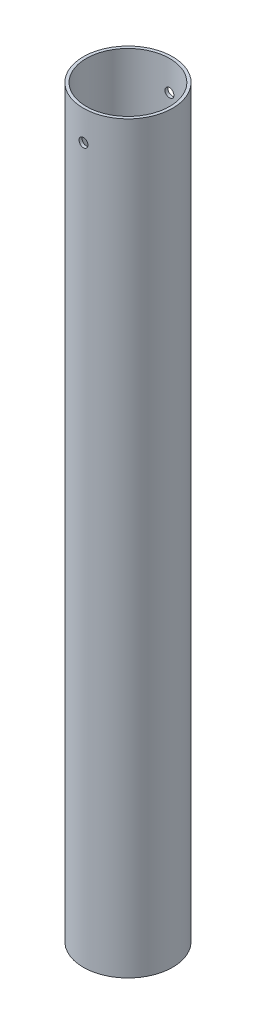
ISO-10303-21;
HEADER;
FILE_DESCRIPTION(('STEP AP214'),'2;1');
FILE_NAME('part.step','',(''),(''),'','','');
FILE_SCHEMA(('AUTOMOTIVE_DESIGN { 1 0 10303 214 1 1 1 1 }'));
ENDSEC;
DATA;
#1=APPLICATION_CONTEXT('core data for automotive mechanical design processes');
#2=APPLICATION_PROTOCOL_DEFINITION('international standard','automotive_design',2000,#1);
#3=PRODUCT_CONTEXT('',#1,'mechanical');
#4=PRODUCT('Part','Part','',(#3));
#5=PRODUCT_RELATED_PRODUCT_CATEGORY('part','',(#4));
#6=PRODUCT_DEFINITION_FORMATION('','',#4);
#7=PRODUCT_DEFINITION_CONTEXT('part definition',#1,'design');
#8=PRODUCT_DEFINITION('design','',#6,#7);
#9=PRODUCT_DEFINITION_SHAPE('','',#8);
#10=(LENGTH_UNIT() NAMED_UNIT(*) SI_UNIT(.MILLI.,.METRE.));
#11=(NAMED_UNIT(*) PLANE_ANGLE_UNIT() SI_UNIT($,.RADIAN.));
#12=(NAMED_UNIT(*) SI_UNIT($,.STERADIAN.) SOLID_ANGLE_UNIT());
#13=UNCERTAINTY_MEASURE_WITH_UNIT(LENGTH_MEASURE(1.E-05),#10,'distance_accuracy_value','');
#14=(GEOMETRIC_REPRESENTATION_CONTEXT(3) GLOBAL_UNCERTAINTY_ASSIGNED_CONTEXT((#13)) GLOBAL_UNIT_ASSIGNED_CONTEXT((#10,
#11,#12)) REPRESENTATION_CONTEXT('',''));
#15=CARTESIAN_POINT('',(0.,0.,0.));
#16=DIRECTION('',(0.,0.,1.));
#17=DIRECTION('',(1.,0.,0.));
#18=AXIS2_PLACEMENT_3D('',#15,#16,#17);
#19=CARTESIAN_POINT('',(0.,250.,0.));
#20=DIRECTION('',(0.,1.,0.));
#21=DIRECTION('',(0.,0.,1.));
#22=AXIS2_PLACEMENT_3D('',#19,#20,#21);
#23=PLANE('',#22);
#24=CARTESIAN_POINT('',(0.,250.,0.));
#25=DIRECTION('',(0.,1.,0.));
#26=DIRECTION('',(0.,0.,1.));
#27=AXIS2_PLACEMENT_3D('',#24,#25,#26);
#28=CIRCLE('',#27,15.);
#29=CARTESIAN_POINT('',(0.,250.,15.));
#30=VERTEX_POINT('',#29);
#31=EDGE_CURVE('E10',#30,#30,#28,.T.);
#32=ORIENTED_EDGE('',*,*,#31,.T.);
#33=EDGE_LOOP('',(#32));
#34=FACE_BOUND('',#33,.T.);
#35=CARTESIAN_POINT('',(0.,250.,0.));
#36=DIRECTION('',(0.,1.,0.));
#37=DIRECTION('',(0.,0.,1.));
#38=AXIS2_PLACEMENT_3D('',#35,#36,#37);
#39=CIRCLE('',#38,14.);
#40=CARTESIAN_POINT('',(0.,250.,14.));
#41=VERTEX_POINT('',#40);
#42=EDGE_CURVE('E63',#41,#41,#39,.T.);
#43=ORIENTED_EDGE('',*,*,#42,.F.);
#44=EDGE_LOOP('',(#43));
#45=FACE_BOUND('',#44,.T.);
#46=ADVANCED_FACE('F42',(#34,#45),#23,.T.);
#47=CARTESIAN_POINT('',(0.,0.,0.));
#48=DIRECTION('',(0.,1.,0.));
#49=DIRECTION('',(0.,0.,1.));
#50=AXIS2_PLACEMENT_3D('',#47,#48,#49);
#51=PLANE('',#50);
#52=CARTESIAN_POINT('',(0.,0.,0.));
#53=DIRECTION('',(0.,1.,0.));
#54=DIRECTION('',(0.,0.,1.));
#55=AXIS2_PLACEMENT_3D('',#52,#53,#54);
#56=CIRCLE('',#55,15.);
#57=CARTESIAN_POINT('',(0.,0.,15.));
#58=VERTEX_POINT('',#57);
#59=EDGE_CURVE('E57',#58,#58,#56,.T.);
#60=ORIENTED_EDGE('',*,*,#59,.F.);
#61=EDGE_LOOP('',(#60));
#62=FACE_BOUND('',#61,.T.);
#63=CARTESIAN_POINT('',(0.,0.,0.));
#64=DIRECTION('',(0.,1.,0.));
#65=DIRECTION('',(0.,0.,1.));
#66=AXIS2_PLACEMENT_3D('',#63,#64,#65);
#67=CIRCLE('',#66,14.);
#68=CARTESIAN_POINT('',(0.,0.,14.));
#69=VERTEX_POINT('',#68);
#70=EDGE_CURVE('E66',#69,#69,#67,.T.);
#71=ORIENTED_EDGE('',*,*,#70,.T.);
#72=EDGE_LOOP('',(#71));
#73=FACE_BOUND('',#72,.T.);
#74=ADVANCED_FACE('F107',(#62,#73),#51,.F.);
#75=CARTESIAN_POINT('',(0.,250.,0.));
#76=DIRECTION('',(0.,-1.,0.));
#77=DIRECTION('',(0.,0.,-1.));
#78=AXIS2_PLACEMENT_3D('',#75,#76,#77);
#79=CYLINDRICAL_SURFACE('',#78,15.);
#80=CARTESIAN_POINT('',(0.,241.5,-15.));
#81=CARTESIAN_POINT('',(-0.0840305306873362,241.499996361149,-14.9999990328115));
#82=CARTESIAN_POINT('',(-0.168116617751661,241.492915096655,-14.9992863839431));
#83=CARTESIAN_POINT('',(-0.333957597745255,241.464773444564,-14.9965120139211));
#84=CARTESIAN_POINT('',(-0.415709818753238,241.443697655963,-14.9944488065104));
#85=CARTESIAN_POINT('',(-0.574457513180118,241.388186639103,-14.9892062184461));
#86=CARTESIAN_POINT('',(-0.651455826922365,241.353759479222,-14.9860275120106));
#87=CARTESIAN_POINT('',(-0.798564241440613,241.272538638103,-14.9789093609146));
#88=CARTESIAN_POINT('',(-0.868675708168614,241.225747416,-14.974970067572));
#89=CARTESIAN_POINT('',(-1.00028932601112,241.120945953507,-14.9667561651199));
#90=CARTESIAN_POINT('',(-1.06176321725234,241.062900300897,-14.962480523608));
#91=CARTESIAN_POINT('',(-1.17411378214648,240.937313198605,-14.9540843535939));
#92=CARTESIAN_POINT('',(-1.22498996562398,240.869771309936,-14.9499638322738));
#93=CARTESIAN_POINT('',(-1.31480095566543,240.726932202475,-14.9423338732918));
#94=CARTESIAN_POINT('',(-1.35371019818232,240.651618833858,-14.9388257506636));
#95=CARTESIAN_POINT('',(-1.41831957711414,240.495486621143,-14.9328305631979));
#96=CARTESIAN_POINT('',(-1.44402003988694,240.414667913124,-14.9303434731333));
#97=CARTESIAN_POINT('',(-1.48139856240285,240.250107298701,-14.9266812610947));
#98=CARTESIAN_POINT('',(-1.4931234795057,240.166376134722,-14.9255017559714));
#99=CARTESIAN_POINT('',(-1.50236292770304,239.998126704906,-14.9245746459079));
#100=CARTESIAN_POINT('',(-1.4998778323062,239.913608459817,-14.9248270033312));
#101=CARTESIAN_POINT('',(-1.48080642037902,239.74650703546,-14.926731103484));
#102=CARTESIAN_POINT('',(-1.46427126618683,239.663917951007,-14.9283777688598));
#103=CARTESIAN_POINT('',(-1.41764871622589,239.502693055198,-14.9328770143113));
#104=CARTESIAN_POINT('',(-1.38756113738363,239.424057297262,-14.9357296106774));
#105=CARTESIAN_POINT('',(-1.31463134082227,239.272809619052,-14.9423251417811));
#106=CARTESIAN_POINT('',(-1.27176642407997,239.200208715766,-14.9460696586224));
#107=CARTESIAN_POINT('',(-1.17451504102984,239.063212177632,-14.9540257759932));
#108=CARTESIAN_POINT('',(-1.12012823750475,238.998816783027,-14.9582373901918));
#109=CARTESIAN_POINT('',(-1.0010911686181,238.879761909016,-14.9666757796948));
#110=CARTESIAN_POINT('',(-0.93639671827704,238.825146597179,-14.970902539995));
#111=CARTESIAN_POINT('',(-0.798734222605659,238.727544550634,-14.9788774361778));
#112=CARTESIAN_POINT('',(-0.725766167999389,238.684557828965,-14.9826255715238));
#113=CARTESIAN_POINT('',(-0.573597158538536,238.611434969535,-14.9892221350064));
#114=CARTESIAN_POINT('',(-0.494395119584847,238.581301072773,-14.9920704062215));
#115=CARTESIAN_POINT('',(-0.332020825994894,238.534771624932,-14.9965447116211));
#116=CARTESIAN_POINT('',(-0.248848690164897,238.518375663014,-14.9981707823559));
#117=CARTESIAN_POINT('',(-0.0812776486378544,238.499843538398,-15.0000127750247));
#118=CARTESIAN_POINT('',(0.00311445315823729,238.497646427621,-15.000234724016));
#119=CARTESIAN_POINT('',(0.171065689973546,238.507414294573,-14.999259626352));
#120=CARTESIAN_POINT('',(0.2546248362307,238.519379080973,-14.998062598867));
#121=CARTESIAN_POINT('',(0.418362310252006,238.557080543132,-14.9943879230879));
#122=CARTESIAN_POINT('',(0.498547273458024,238.582788681717,-14.9919129287706));
#123=CARTESIAN_POINT('',(0.65346648207567,238.647217761056,-14.9859599829091));
#124=CARTESIAN_POINT('',(0.728200605235675,238.685938993559,-14.9824820088788));
#125=CARTESIAN_POINT('',(0.870372270258211,238.775446257996,-14.9748971299563));
#126=CARTESIAN_POINT('',(0.93778448962337,238.826272333389,-14.9707881540516));
#127=CARTESIAN_POINT('',(1.06314243496781,238.938489101611,-14.9624089930428));
#128=CARTESIAN_POINT('',(1.12108792327376,238.999880059605,-14.9581388038946));
#129=CARTESIAN_POINT('',(1.22607916483072,239.131749861988,-14.9499003621113));
#130=CARTESIAN_POINT('',(1.27308491801932,239.202260634814,-14.9459332520846));
#131=CARTESIAN_POINT('',(1.35458738811574,239.35021104022,-14.9387674869133));
#132=CARTESIAN_POINT('',(1.38908427608082,239.427650578033,-14.9355688212606));
#133=CARTESIAN_POINT('',(1.44452281302671,239.587123109199,-14.9303092145107));
#134=CARTESIAN_POINT('',(1.46548826221779,239.669147760137,-14.9282462767468));
#135=CARTESIAN_POINT('',(1.4933460106942,239.835574796941,-14.9254854792431));
#136=CARTESIAN_POINT('',(1.50023871359928,239.919977114543,-14.9247875803528));
#137=CARTESIAN_POINT('',(1.49974970770689,240.088366032535,-14.9248366966134));
#138=CARTESIAN_POINT('',(1.49243083438967,240.172352824324,-14.9255773513051));
#139=CARTESIAN_POINT('',(1.46385817944548,240.337897375752,-14.9284065583432));
#140=CARTESIAN_POINT('',(1.44260438214325,240.419455132659,-14.9304951122058));
#141=CARTESIAN_POINT('',(1.38678252944627,240.577826023572,-14.9357830239478));
#142=CARTESIAN_POINT('',(1.35221631651139,240.654639812445,-14.9389822281054));
#143=CARTESIAN_POINT('',(1.27075733236658,240.801385337507,-14.9461312775904));
#144=CARTESIAN_POINT('',(1.22386463018314,240.871317112231,-14.9500811187143));
#145=CARTESIAN_POINT('',(1.11884783442801,241.002635511708,-14.9583073081455));
#146=CARTESIAN_POINT('',(1.06067692333541,241.063984614551,-14.9625849709013));
#147=CARTESIAN_POINT('',(0.934847548837676,241.176078349049,-14.9709728209317));
#148=CARTESIAN_POINT('',(0.867186816162399,241.226820437036,-14.9750829678446));
#149=CARTESIAN_POINT('',(0.72411215124195,241.316360180782,-14.9826834310374));
#150=CARTESIAN_POINT('',(0.648679124020161,241.355127436418,-14.9861721604022));
#151=CARTESIAN_POINT('',(0.492387418650836,241.419393634236,-14.9921194387484));
#152=CARTESIAN_POINT('',(0.411534974738418,241.44490753643,-14.9945791486448));
#153=CARTESIAN_POINT('',(0.275187392108554,241.475580925627,-14.997573206606));
#154=CARTESIAN_POINT('',(0.220563829266762,241.484725566449,-14.9984790103775));
#155=CARTESIAN_POINT('',(0.11063487122597,241.496936289093,-14.9996927242618));
#156=CARTESIAN_POINT('',(0.0553294788398371,241.500002395983,-15.0000006368404));
#157=CARTESIAN_POINT('',(0.,241.5,-15.));
#158=B_SPLINE_CURVE_WITH_KNOTS('',3,(#80,#81,#82,#83,#84,#85,#86,#87,#88,#89,#90,#91,#92,#93,
#94,#95,#96,#97,#98,#99,#100,#101,#102,#103,#104,#105,#106,#107,#108,#109,#110,#111,#112,#113,
#114,#115,#116,#117,#118,#119,#120,#121,#122,#123,#124,#125,#126,#127,#128,#129,#130,#131,#132,
#133,#134,#135,#136,#137,#138,#139,#140,#141,#142,#143,#144,#145,#146,#147,#148,#149,#150,#151,
#152,#153,#154,#155,#156,#157),.UNSPECIFIED.,.T.,.F.,(4,2,2,2,2,2,2,2,2,2,2,2,2,2,2,2,2,2,2,2,2,
2,2,2,2,2,2,2,2,2,2,2,2,2,2,2,2,2,4),(0.,0.25188954940271,0.504056764253229,0.756071828598298,
1.00803680637418,1.26080785293443,1.51359058831057,1.76690963208333,2.02022241663757,
2.27268348067798,2.52513790883666,2.77667696161665,3.02821941242449,3.28021142059345,
3.5322108049669,3.78532101294313,4.03843150469659,4.29158611040374,4.54473314513161,
4.79679282911637,5.04884910778716,5.30038402941458,5.55192459074202,5.80430911123048,
6.05669996715345,6.309999654129,6.56329587713061,6.81614535889503,7.0689875885938,
7.32071443940935,7.57244157339056,7.82413388044199,8.07582477808442,8.3285837614148,
8.58140328955437,8.83485946539363,9.08802892192945,9.25388500848524,9.41974041103543),.UNSPECIFIED.);
#159=CARTESIAN_POINT('',(0.,241.5,-15.));
#160=VERTEX_POINT('',#159);
#161=EDGE_CURVE('E93',#160,#160,#158,.T.);
#162=ORIENTED_EDGE('',*,*,#161,.T.);
#163=EDGE_LOOP('',(#162));
#164=FACE_BOUND('',#163,.T.);
#165=CARTESIAN_POINT('',(1.5,240.,14.9248115565993));
#166=CARTESIAN_POINT('',(1.49999636009027,239.91597065374,14.9248125419535));
#167=CARTESIAN_POINT('',(1.49291528847372,239.831885747382,14.9255288549133));
#168=CARTESIAN_POINT('',(1.46477447214535,239.66604722056,14.9283163133718));
#169=CARTESIAN_POINT('',(1.44369932232966,239.584296272944,14.9303889519183));
#170=CARTESIAN_POINT('',(1.38819017410339,239.425551271173,14.9356519957108));
#171=CARTESIAN_POINT('',(1.35376427444085,239.348554365913,14.9388417232018));
#172=CARTESIAN_POINT('',(1.27254640108666,239.201448311562,14.9459787085773));
#173=CARTESIAN_POINT('',(1.2257568834389,239.131337798274,14.9499258159649));
#174=CARTESIAN_POINT('',(1.12095714299807,238.999723104514,14.9581489006485));
#175=CARTESIAN_POINT('',(1.0629111271624,238.938247485744,14.962425900079));
#176=CARTESIAN_POINT('',(0.937322572979352,238.825893586495,14.9708175785358));
#177=CARTESIAN_POINT('',(0.86977960035986,238.775015790891,14.9749322501282));
#178=CARTESIAN_POINT('',(0.726939542476489,238.685203114489,14.9825457473341));
#179=CARTESIAN_POINT('',(0.651626493794362,238.646293501809,14.9860432634197));
#180=CARTESIAN_POINT('',(0.495494976431271,238.581683350277,14.9920172531366));
#181=CARTESIAN_POINT('',(0.41467664200233,238.555982489446,14.994493751656));
#182=CARTESIAN_POINT('',(0.250117174114426,238.51860313597,14.9981394985654));
#183=CARTESIAN_POINT('',(0.166386790547376,238.506877750875,14.9993131176423));
#184=CARTESIAN_POINT('',(-0.00186111103340791,238.497637096299,15.0002357339804));
#185=CARTESIAN_POINT('',(-0.0863786085816849,238.500121458381,14.9999847681791));
#186=CARTESIAN_POINT('',(-0.253483266096833,238.519191708975,14.9980900696678));
#187=CARTESIAN_POINT('',(-0.336076244902462,238.535727173346,14.9964513172757));
#188=CARTESIAN_POINT('',(-0.497308769256792,238.58235169342,14.991970938974));
#189=CARTESIAN_POINT('',(-0.575948263436585,238.612440925181,14.9891292974393));
#190=CARTESIAN_POINT('',(-0.727200472019367,238.685374144882,14.9825540622587));
#191=CARTESIAN_POINT('',(-0.79980235647246,238.728240446295,14.9788189104864));
#192=CARTESIAN_POINT('',(-0.936800269761278,238.825494785005,14.9708757677911));
#193=CARTESIAN_POINT('',(-1.00119605784123,238.879883160218,14.9666677630022));
#194=CARTESIAN_POINT('',(-1.12024915773402,238.99892134427,14.9582294020178));
#195=CARTESIAN_POINT('',(-1.1748626192855,239.063615017112,14.9539990285954));
#196=CARTESIAN_POINT('',(-1.27246130303686,239.201275297816,14.9460110989233));
#197=CARTESIAN_POINT('',(-1.31544650836932,239.274241917678,14.9422535433595));
#198=CARTESIAN_POINT('',(-1.38856827685983,239.4264105378,14.9356363427122));
#199=CARTESIAN_POINT('',(-1.41870213085943,239.505613848634,14.9327768869883));
#200=CARTESIAN_POINT('',(-1.46523110345638,239.667990906922,14.9282835280641));
#201=CARTESIAN_POINT('',(-1.48162664061455,239.751164533331,14.9266495875265));
#202=CARTESIAN_POINT('',(-1.50015716308794,239.918736269294,14.9247987079113));
#203=CARTESIAN_POINT('',(-1.50235349497082,240.003127530397,14.924575673214));
#204=CARTESIAN_POINT('',(-1.49258437030704,240.171076898734,14.9255557703216));
#205=CARTESIAN_POINT('',(-1.48061910511463,240.254635017211,14.9267588828559));
#206=CARTESIAN_POINT('',(-1.44291776176129,240.418367373417,14.930450166336));
#207=CARTESIAN_POINT('',(-1.41721069078337,240.498548356642,14.9329356300202));
#208=CARTESIAN_POINT('',(-1.35278507951392,240.653460077595,14.9389093655819));
#209=CARTESIAN_POINT('',(-1.3140662411754,240.728190690431,14.94239766043));
#210=CARTESIAN_POINT('',(-1.22456250213485,240.870359961043,14.9499987653357));
#211=CARTESIAN_POINT('',(-1.17373694976106,240.937772912949,14.9541136622201));
#212=CARTESIAN_POINT('',(-1.06152080017678,241.063132579911,14.9624974893778));
#213=CARTESIAN_POINT('',(-1.00012994137222,241.12107906051,14.966766423463));
#214=CARTESIAN_POINT('',(-0.868259706339731,241.226072450097,14.9749957177395));
#215=CARTESIAN_POINT('',(-0.797748383954202,241.273079339379,14.9789549108321));
#216=CARTESIAN_POINT('',(-0.649796576125724,241.35458380276,14.9861016315995));
#217=CARTESIAN_POINT('',(-0.572356185644464,241.389081548261,14.9892891698474));
#218=CARTESIAN_POINT('',(-0.412884189649243,241.444520651483,14.9945281562101));
#219=CARTESIAN_POINT('',(-0.330861056474955,241.465486180988,14.9965816290847));
#220=CARTESIAN_POINT('',(-0.164437220975529,241.49334460437,14.9993294192047));
#221=CARTESIAN_POINT('',(-0.0800365855383359,241.500237893751,15.0000237746484));
#222=CARTESIAN_POINT('',(0.0883533361136112,241.49975060034,14.999975074699));
#223=CARTESIAN_POINT('',(0.172342810836783,241.492432144745,14.99923827565));
#224=CARTESIAN_POINT('',(0.337892832534536,241.463859381515,14.9964224036639));
#225=CARTESIAN_POINT('',(0.419453377602541,241.442605062941,14.9943433296731));
#226=CARTESIAN_POINT('',(0.577829863151607,241.386781113911,14.9890758572094));
#227=CARTESIAN_POINT('',(0.654646449116282,241.352213299599,14.9858876100487));
#228=CARTESIAN_POINT('',(0.801396900232183,241.270750246625,14.9787571862444));
#229=CARTESIAN_POINT('',(0.87133080565283,241.223855080093,14.9748150140123));
#230=CARTESIAN_POINT('',(1.0026490866404,241.118835571464,14.9665977700358));
#231=CARTESIAN_POINT('',(1.06399638932901,241.060664975633,14.9623213719105));
#232=CARTESIAN_POINT('',(1.17608663908972,240.934836972682,14.9539288615449));
#233=CARTESIAN_POINT('',(1.22682703777178,240.867177292246,14.9498127880167));
#234=CARTESIAN_POINT('',(1.31636496063609,240.72410348712,14.942195751159));
#235=CARTESIAN_POINT('',(1.35513178199226,240.648670078014,14.9386963788796));
#236=CARTESIAN_POINT('',(1.41939706214815,240.492377563131,14.9327279214369));
#237=CARTESIAN_POINT('',(1.44491048683479,240.411524694111,14.9302576748004));
#238=CARTESIAN_POINT('',(1.4755825325003,240.275178388651,14.9272501130722));
#239=CARTESIAN_POINT('',(1.48472656859734,240.22055662304,14.9263399790354));
#240=CARTESIAN_POINT('',(1.49693648790767,240.110631265436,14.9251203776649));
#241=CARTESIAN_POINT('',(1.5000023966359,240.055327676306,14.9248109078098));
#242=CARTESIAN_POINT('',(1.5,240.,14.9248115565993));
#243=B_SPLINE_CURVE_WITH_KNOTS('',3,(#165,#166,#167,#168,#169,#170,#171,#172,#173,#174,#175,
#176,#177,#178,#179,#180,#181,#182,#183,#184,#185,#186,#187,#188,#189,#190,#191,#192,#193,#194,
#195,#196,#197,#198,#199,#200,#201,#202,#203,#204,#205,#206,#207,#208,#209,#210,#211,#212,#213,
#214,#215,#216,#217,#218,#219,#220,#221,#222,#223,#224,#225,#226,#227,#228,#229,#230,#231,#232,
#233,#234,#235,#236,#237,#238,#239,#240,#241,#242),.UNSPECIFIED.,.T.,.F.,(4,2,2,2,2,2,2,2,2,2,2,
2,2,2,2,2,2,2,2,2,2,2,2,2,2,2,2,2,2,2,2,2,2,2,2,2,2,2,4),(0.,0.251885991654684,
0.504049727732647,0.756060736496216,1.00802172063196,1.26079742294888,1.51358468782879,
1.76690204956938,2.02021323611692,2.27267206347675,2.52512434497349,2.77667447727992,
3.02822787721461,3.28022318199618,3.53222587827794,3.78533137627501,4.03843724141341,
4.29159643676897,4.5447479189255,4.79680494461652,5.04885856450306,5.30038222056791,
5.55191163841569,5.80429784717576,6.05669030584803,6.30999205227176,6.56329032777008,
6.81613489041543,7.06897234669725,7.32070700202726,7.57244185494989,7.82414237992871,
8.075841432162,8.32859572556985,8.5814106755179,8.83486861605718,9.08803972341005,
9.25389041409071,9.41974040855725),.UNSPECIFIED.);
#244=CARTESIAN_POINT('',(1.5,240.,14.9248115565993));
#245=VERTEX_POINT('',#244);
#246=EDGE_CURVE('E87',#245,#245,#243,.T.);
#247=ORIENTED_EDGE('',*,*,#246,.T.);
#248=EDGE_LOOP('',(#247));
#249=FACE_BOUND('',#248,.T.);
#250=ORIENTED_EDGE('',*,*,#31,.F.);
#251=EDGE_LOOP('',(#250));
#252=FACE_BOUND('',#251,.T.);
#253=ORIENTED_EDGE('',*,*,#59,.T.);
#254=EDGE_LOOP('',(#253));
#255=FACE_BOUND('',#254,.T.);
#256=ADVANCED_FACE('F44',(#164,#249,#252,#255),#79,.T.);
#257=CARTESIAN_POINT('',(0.,250.,0.));
#258=DIRECTION('',(0.,-1.,0.));
#259=DIRECTION('',(0.,0.,-1.));
#260=AXIS2_PLACEMENT_3D('',#257,#258,#259);
#261=CYLINDRICAL_SURFACE('',#260,14.);
#262=CARTESIAN_POINT('',(0.,241.5,-14.));
#263=CARTESIAN_POINT('',(-0.0839973684623544,241.499996379298,-13.9999989720618));
#264=CARTESIAN_POINT('',(-0.168049471788856,241.492920677878,-13.9992360275065));
#265=CARTESIAN_POINT('',(-0.333821153364655,241.464802415949,-13.9962658597227));
#266=CARTESIAN_POINT('',(-0.415538096384693,241.443744679266,-13.9940570672004));
#267=CARTESIAN_POINT('',(-0.574215086679191,241.38828438885,-13.9884444049242));
#268=CARTESIAN_POINT('',(-0.651178059521742,241.353890139128,-13.9850412789497));
#269=CARTESIAN_POINT('',(-0.798222664781038,241.272749832413,-13.9774199420794));
#270=CARTESIAN_POINT('',(-0.868305612275354,241.226006142276,-13.9732018874118));
#271=CARTESIAN_POINT('',(-0.999904467230658,241.121288298067,-13.964403436078));
#272=CARTESIAN_POINT('',(-1.06138815276101,241.063273753289,-13.959821772381));
#273=CARTESIAN_POINT('',(-1.17376607832022,240.937747376863,-13.9508228918212));
#274=CARTESIAN_POINT('',(-1.22465981597738,240.870235094909,-13.9464056827682));
#275=CARTESIAN_POINT('',(-1.31452903007566,240.727425709059,-13.9382230587834));
#276=CARTESIAN_POINT('',(-1.35347504707262,240.652109965641,-13.9344592647275));
#277=CARTESIAN_POINT('',(-1.41815517868435,240.495960542516,-13.9280256549691));
#278=CARTESIAN_POINT('',(-1.44388966523887,240.415127018221,-13.9253558084694));
#279=CARTESIAN_POINT('',(-1.48131999143386,240.250567033816,-13.9214240491911));
#280=CARTESIAN_POINT('',(-1.49306957301225,240.166852928612,-13.9201567479638));
#281=CARTESIAN_POINT('',(-1.50236273378441,239.998632102199,-13.919156916522));
#282=CARTESIAN_POINT('',(-1.49990673825452,239.914125404794,-13.9194243403621));
#283=CARTESIAN_POINT('',(-1.48090270755367,239.747089755215,-13.9214588185844));
#284=CARTESIAN_POINT('',(-1.46441348676883,239.664554024611,-13.9232196140191));
#285=CARTESIAN_POINT('',(-1.41790265413676,239.503428148725,-13.92803266796));
#286=CARTESIAN_POINT('',(-1.38788083522164,239.424838063837,-13.9310849462276));
#287=CARTESIAN_POINT('',(-1.31509254595637,239.273649381157,-13.9381442300285));
#288=CARTESIAN_POINT('',(-1.27230012313473,239.20106337223,-13.9421531763498));
#289=CARTESIAN_POINT('',(-1.17520397125328,239.064081098341,-13.9506724910759));
#290=CARTESIAN_POINT('',(-1.12089985521527,238.999685108812,-13.9551828763347));
#291=CARTESIAN_POINT('',(-1.00199398737118,238.880569172745,-13.964224741634));
#292=CARTESIAN_POINT('',(-0.937341467650285,238.825899891124,-13.9687562128002));
#293=CARTESIAN_POINT('',(-0.799749932702073,238.728182394229,-13.9773081517919));
#294=CARTESIAN_POINT('',(-0.726810905968593,238.685134195092,-13.9813286189078));
#295=CARTESIAN_POINT('',(-0.574680679930823,238.611882332518,-13.9884071619177));
#296=CARTESIAN_POINT('',(-0.49548815654324,238.581681397988,-13.9914650333095));
#297=CARTESIAN_POINT('',(-0.333116173755552,238.535019300197,-13.996271832416));
#298=CARTESIAN_POINT('',(-0.249936851389147,238.518557665048,-13.9980208050858));
#299=CARTESIAN_POINT('',(-0.0823910032591225,238.499906091921,-14.0000069536861));
#300=CARTESIAN_POINT('',(0.00196765896145283,238.497646272153,-14.0002515320482));
#301=CARTESIAN_POINT('',(0.169862499172712,238.507278704285,-13.999221220073));
#302=CARTESIAN_POINT('',(0.253398689930386,238.519170736159,-13.9979463533593));
#303=CARTESIAN_POINT('',(0.417074417596057,238.556711302749,-13.9940250997174));
#304=CARTESIAN_POINT('',(0.497221580734047,238.582326958795,-13.9913819912927));
#305=CARTESIAN_POINT('',(0.652081625351138,238.646553747399,-13.9850206034345));
#306=CARTESIAN_POINT('',(0.726794368015851,238.685165211774,-13.9813022965487));
#307=CARTESIAN_POINT('',(0.868979698172281,238.774459770022,-13.9731875979172));
#308=CARTESIAN_POINT('',(0.936423420726908,238.825188590914,-13.9687886603917));
#309=CARTESIAN_POINT('',(1.06186365361338,238.937212524445,-13.9598140395794));
#310=CARTESIAN_POINT('',(1.11985989089443,238.998507942374,-13.955238351189));
#311=CARTESIAN_POINT('',(1.22500289525195,239.130230816487,-13.9464035114229));
#312=CARTESIAN_POINT('',(1.27210367548466,239.200695086583,-13.9421457513136));
#313=CARTESIAN_POINT('',(1.35380220515131,239.348574646947,-13.9344504956076));
#314=CARTESIAN_POINT('',(1.38840014719751,239.42598983011,-13.9310129873748));
#315=CARTESIAN_POINT('',(1.44403456823945,239.585418438106,-13.9253563662176));
#316=CARTESIAN_POINT('',(1.46509803019709,239.667422357369,-13.9231348303938));
#317=CARTESIAN_POINT('',(1.4931529650073,239.83382815701,-13.9201543262932));
#318=CARTESIAN_POINT('',(1.50014490677259,239.918229957387,-13.9193953092803));
#319=CARTESIAN_POINT('',(1.49985126967978,240.086578494163,-13.9194269169975));
#320=CARTESIAN_POINT('',(1.49263792882135,240.170525367329,-13.9202097012228));
#321=CARTESIAN_POINT('',(1.46429034750351,240.336007127849,-13.9232199578512));
#322=CARTESIAN_POINT('',(1.44315609462868,240.41754201305,-13.9254474315429));
#323=CARTESIAN_POINT('',(1.38758726934598,240.575882371301,-13.9310938471125));
#324=CARTESIAN_POINT('',(1.35315518471867,240.652688725858,-13.9345125661186));
#325=CARTESIAN_POINT('',(1.27197540134453,240.799443983682,-13.9421567007954));
#326=CARTESIAN_POINT('',(1.22522771211909,240.869392892253,-13.9463821158424));
#327=CARTESIAN_POINT('',(1.12047309614238,241.000817761032,-13.9551893042071));
#328=CARTESIAN_POINT('',(1.06241229533165,241.062250671655,-13.9597727171597));
#329=CARTESIAN_POINT('',(0.936788436693425,241.174531935801,-13.9687645955809));
#330=CARTESIAN_POINT('',(0.86922311628177,241.225377761864,-13.9731730190714));
#331=CARTESIAN_POINT('',(0.726294289727564,241.31515845701,-13.9813315236118));
#332=CARTESIAN_POINT('',(0.650909132345868,241.354059007671,-13.985079694864));
#333=CARTESIAN_POINT('',(0.494683050163419,241.418596502361,-13.9914751074927));
#334=CARTESIAN_POINT('',(0.413848333053759,241.444248259084,-13.9941235777272));
#335=CARTESIAN_POINT('',(0.277138279310817,241.475230607491,-13.997362764335));
#336=CARTESIAN_POINT('',(0.222133982989385,241.484506267702,-13.9983470622526));
#337=CARTESIAN_POINT('',(0.111427819030552,241.496892149859,-13.9996660194708));
#338=CARTESIAN_POINT('',(0.0557259548181643,241.500002402064,-14.0000006819599));
#339=CARTESIAN_POINT('',(0.,241.5,-14.));
#340=B_SPLINE_CURVE_WITH_KNOTS('',3,(#262,#263,#264,#265,#266,#267,#268,#269,#270,#271,#272,
#273,#274,#275,#276,#277,#278,#279,#280,#281,#282,#283,#284,#285,#286,#287,#288,#289,#290,#291,
#292,#293,#294,#295,#296,#297,#298,#299,#300,#301,#302,#303,#304,#305,#306,#307,#308,#309,#310,
#311,#312,#313,#314,#315,#316,#317,#318,#319,#320,#321,#322,#323,#324,#325,#326,#327,#328,#329,
#330,#331,#332,#333,#334,#335,#336,#337,#338,#339),.UNSPECIFIED.,.T.,.F.,(4,2,2,2,2,2,2,2,2,2,2,
2,2,2,2,2,2,2,2,2,2,2,2,2,2,2,2,2,2,2,2,2,2,2,2,2,2,2,4),(0.,0.251788599945352,
0.503850940260842,0.75575658476306,1.00761398480181,1.26039117907525,1.51318036199839,
1.76658792718727,2.01998835788766,2.27241183115225,2.52482774758373,2.77619094881416,
3.02755799638758,3.27943939251039,3.531329257246,3.78449503509989,4.03766116448934,
4.29088104245251,4.54409222301009,4.79605646471764,5.04801678907028,5.29937615584523,
5.55074194097749,5.80307171791346,6.05540878638004,6.30879222304766,6.56217175605479,
6.81504455967778,7.06790893654698,7.31949074464278,7.57107277711324,7.82260776597886,
8.07414256037933,8.32690582830002,8.57972936954861,8.8332726124194,9.08653176657271,
9.25357544028006,9.42061829413532),.UNSPECIFIED.);
#341=CARTESIAN_POINT('',(0.,241.5,-14.));
#342=VERTEX_POINT('',#341);
#343=EDGE_CURVE('E47',#342,#342,#340,.T.);
#344=ORIENTED_EDGE('',*,*,#343,.F.);
#345=EDGE_LOOP('',(#344));
#346=FACE_BOUND('',#345,.T.);
#347=CARTESIAN_POINT('',(1.5,240.,13.9194109070751));
#348=CARTESIAN_POINT('',(1.4999963779085,239.916004191728,13.9194119572178));
#349=CARTESIAN_POINT('',(1.49292093045989,239.831953643776,13.9201794062857));
#350=CARTESIAN_POINT('',(1.46480376899873,239.666185193758,13.923165663132));
#351=CARTESIAN_POINT('',(1.44374687338791,239.584469928146,13.9253860485269));
#352=CARTESIAN_POINT('',(1.38828904327733,239.425796485079,13.9310238524709));
#353=CARTESIAN_POINT('',(1.35389645274878,239.348835367852,13.9344405223908));
#354=CARTESIAN_POINT('',(1.27276005356359,239.201793872972,13.9420850071975));
#355=CARTESIAN_POINT('',(1.22601860770073,239.131712182543,13.9463126668696));
#356=CARTESIAN_POINT('',(1.12130303257902,239.000111912957,13.9551224412933));
#357=CARTESIAN_POINT('',(1.06328801102761,238.93862595275,13.9597058087989));
#358=CARTESIAN_POINT('',(0.937759725321601,238.826243635644,13.9686992291172));
#359=CARTESIAN_POINT('',(0.87024601707709,238.775347774137,13.9731092738142));
#360=CARTESIAN_POINT('',(0.727435376746572,238.685476335304,13.9812716736442));
#361=CARTESIAN_POINT('',(0.652120050443132,238.646529828412,13.9850224155117));
#362=CARTESIAN_POINT('',(0.495971533764539,238.581848676091,13.9914299277732));
#363=CARTESIAN_POINT('',(0.415138496389538,238.55611366449,13.9940867284868));
#364=CARTESIAN_POINT('',(0.250580022201061,238.518682246808,13.9979982060385));
#365=CARTESIAN_POINT('',(0.166866950414414,238.506932050953,13.9992582539121));
#366=CARTESIAN_POINT('',(-0.00135185114796666,238.497637303557,14.000252540958));
#367=CARTESIAN_POINT('',(-0.0858575574938418,238.50009233343,13.9999868250901));
#368=CARTESIAN_POINT('',(-0.252897455974457,238.51909483163,13.9979639059307));
#369=CARTESIAN_POINT('',(-0.335438312762994,238.535584457762,13.9962128245251));
#370=CARTESIAN_POINT('',(-0.496574231600782,238.582097876534,13.9914229299824));
#371=CARTESIAN_POINT('',(-0.57516923594324,238.612121867045,13.9883840980186));
#372=CARTESIAN_POINT('',(-0.726363896175786,238.684914660202,13.9813497504685));
#373=CARTESIAN_POINT('',(-0.798951208249191,238.727708909881,13.9773523278718));
#374=CARTESIAN_POINT('',(-0.935935314381955,238.824808964827,13.9688490017733));
#375=CARTESIAN_POINT('',(-1.00033183235971,238.879115157956,13.9643430811415));
#376=CARTESIAN_POINT('',(-1.11944543584153,238.998022503577,13.9553013382367));
#377=CARTESIAN_POINT('',(-1.1741122754163,239.062673998781,13.9507654794566));
#378=CARTESIAN_POINT('',(-1.2718253326591,239.200262612219,13.9421975977028));
#379=CARTESIAN_POINT('',(-1.31487152910624,239.273199745584,13.9381655756491));
#380=CARTESIAN_POINT('',(-1.3881219492537,239.425329449422,13.9310616518798));
#381=CARTESIAN_POINT('',(-1.41832282721614,239.504523643271,13.9279900003608));
#382=CARTESIAN_POINT('',(-1.46498430040181,239.666899258405,13.923159706957));
#383=CARTESIAN_POINT('',(-1.48144537770504,239.75008053969,13.9214010190053));
#384=CARTESIAN_POINT('',(-1.50009484563834,239.917627313746,13.9194038882243));
#385=CARTESIAN_POINT('',(-1.50235363989616,240.001984884148,13.9191579465341));
#386=CARTESIAN_POINT('',(-1.49271954643616,240.169877294701,13.9201943559554));
#387=CARTESIAN_POINT('',(-1.48082687880356,240.253412147627,13.921476683299));
#388=CARTESIAN_POINT('',(-1.44328645403507,240.417081145756,13.9254183184659));
#389=CARTESIAN_POINT('',(-1.41767219709813,240.497223062521,13.9280742721431));
#390=CARTESIAN_POINT('',(-1.35344996280734,240.652073233003,13.9344611829005));
#391=CARTESIAN_POINT('',(-1.31484164536737,240.726781344441,13.9381921681163));
#392=CARTESIAN_POINT('',(-1.2255517328518,240.868963494479,13.9463268604645));
#393=CARTESIAN_POINT('',(-1.17482361160314,240.936408165543,13.9507331359743));
#394=CARTESIAN_POINT('',(-1.06280052006878,241.061850637861,13.9597136223586));
#395=CARTESIAN_POINT('',(-1.00150524915135,241.119848170254,13.9642878380082));
#396=CARTESIAN_POINT('',(-0.869781814819262,241.224994008394,13.9731115529405));
#397=CARTESIAN_POINT('',(-0.799316810355234,241.272096297289,13.9773596260725));
#398=CARTESIAN_POINT('',(-0.651435375612058,241.353797473395,13.9850315109083));
#399=CARTESIAN_POINT('',(-0.574019052737086,241.388396553751,13.9884553353445));
#400=CARTESIAN_POINT('',(-0.414591135681026,241.444031719967,13.994086542467));
#401=CARTESIAN_POINT('',(-0.332589220362594,241.465095282064,13.9962963881199));
#402=CARTESIAN_POINT('',(-0.166187649934908,241.493151096061,13.9992607885866));
#403=CARTESIAN_POINT('',(-0.0817880729887994,241.500143806134,14.0000153907857));
#404=CARTESIAN_POINT('',(0.0865617548742593,241.499852425078,13.9999842053307));
#405=CARTESIAN_POINT('',(0.170512139699039,241.492639641366,13.9992061113591));
#406=CARTESIAN_POINT('',(0.336001063502519,241.464291939679,13.9962121633387));
#407=CARTESIAN_POINT('',(0.417539601401246,241.443157015469,13.9939963086461));
#408=CARTESIAN_POINT('',(0.575887334320111,241.387585453123,13.9883749797482));
#409=CARTESIAN_POINT('',(0.652697396259562,241.353151261747,13.9849697243763));
#410=CARTESIAN_POINT('',(0.79945919077098,241.271966115961,13.9773485137443));
#411=CARTESIAN_POINT('',(0.869410930945669,241.225215175205,13.9731325593828));
#412=CARTESIAN_POINT('',(1.00083567707109,241.120456965186,13.9643365063724));
#413=CARTESIAN_POINT('',(1.0622662243951,241.062396566719,13.9597547516974));
#414=CARTESIAN_POINT('',(1.17454290815383,240.936774487617,13.950757334422));
#415=CARTESIAN_POINT('',(1.22538651090995,240.869210539051,13.9463417117874));
#416=CARTESIAN_POINT('',(1.31516479258672,240.726282847993,13.9381629302096));
#417=CARTESIAN_POINT('',(1.35406475911252,240.650897206763,13.9344016865968));
#418=CARTESIAN_POINT('',(1.41860102800187,240.494670102012,13.9279802013449));
#419=CARTESIAN_POINT('',(1.44425215073791,240.413834849495,13.9253187301522));
#420=CARTESIAN_POINT('',(1.47523272696941,240.277126489196,13.922062801924));
#421=CARTESIAN_POINT('',(1.48450758946156,240.222124546847,13.9210731090702));
#422=CARTESIAN_POINT('',(1.4968924119992,240.111423097861,13.9197468149444));
#423=CARTESIAN_POINT('',(1.50000240292895,240.055723594721,13.9194102104006));
#424=CARTESIAN_POINT('',(1.5,240.,13.9194109070751));
#425=B_SPLINE_CURVE_WITH_KNOTS('',3,(#347,#348,#349,#350,#351,#352,#353,#354,#355,#356,#357,
#358,#359,#360,#361,#362,#363,#364,#365,#366,#367,#368,#369,#370,#371,#372,#373,#374,#375,#376,
#377,#378,#379,#380,#381,#382,#383,#384,#385,#386,#387,#388,#389,#390,#391,#392,#393,#394,#395,
#396,#397,#398,#399,#400,#401,#402,#403,#404,#405,#406,#407,#408,#409,#410,#411,#412,#413,#414,
#415,#416,#417,#418,#419,#420,#421,#422,#423,#424),.UNSPECIFIED.,.T.,.F.,(4,2,2,2,2,2,2,2,2,2,2,
2,2,2,2,2,2,2,2,2,2,2,2,2,2,2,2,2,2,2,2,2,2,2,2,2,2,2,4),(0.,0.251783913330533,0.50384167146725,
0.755741974162355,1.00759411385447,1.26037744147799,1.51317259135173,1.7665779529263,
2.01997629069675,2.27239680021156,2.52480987167731,2.77618765734664,3.02756911826311,
3.27945488538692,3.5313491404066,3.78450869397509,4.0376687098446,4.29089462436265,
4.54411165372383,4.79607243820296,5.0480293042091,5.29937382188553,5.55072491836984,
5.80305687391892,6.05539600940942,6.30878221196359,6.56216450014449,6.81503079998948,
7.06788886589704,7.31948089314305,7.57107303304474,7.82261890778984,8.07416450368322,
8.32692161440706,8.57973914587837,8.83328464632587,9.08654590902362,9.25358251859521,
9.42061829135888),.UNSPECIFIED.);
#426=CARTESIAN_POINT('',(1.5,240.,13.9194109070751));
#427=VERTEX_POINT('',#426);
#428=EDGE_CURVE('E68',#427,#427,#425,.T.);
#429=ORIENTED_EDGE('',*,*,#428,.F.);
#430=EDGE_LOOP('',(#429));
#431=FACE_BOUND('',#430,.T.);
#432=ORIENTED_EDGE('',*,*,#42,.T.);
#433=EDGE_LOOP('',(#432));
#434=FACE_BOUND('',#433,.T.);
#435=ORIENTED_EDGE('',*,*,#70,.F.);
#436=EDGE_LOOP('',(#435));
#437=FACE_BOUND('',#436,.T.);
#438=ADVANCED_FACE('F74',(#346,#431,#434,#437),#261,.F.);
#439=CARTESIAN_POINT('',(0.,240.,-15.));
#440=DIRECTION('',(0.,0.,1.));
#441=DIRECTION('',(1.,0.,0.));
#442=AXIS2_PLACEMENT_3D('',#439,#440,#441);
#443=CYLINDRICAL_SURFACE('',#442,1.5);
#444=ORIENTED_EDGE('',*,*,#428,.T.);
#445=EDGE_LOOP('',(#444));
#446=FACE_BOUND('',#445,.T.);
#447=ORIENTED_EDGE('',*,*,#246,.F.);
#448=EDGE_LOOP('',(#447));
#449=FACE_BOUND('',#448,.T.);
#450=ADVANCED_FACE('F80',(#446,#449),#443,.F.);
#451=ORIENTED_EDGE('',*,*,#343,.T.);
#452=EDGE_LOOP('',(#451));
#453=FACE_BOUND('',#452,.T.);
#454=ORIENTED_EDGE('',*,*,#161,.F.);
#455=EDGE_LOOP('',(#454));
#456=FACE_BOUND('',#455,.T.);
#457=ADVANCED_FACE('F77',(#453,#456),#443,.F.);
#458=CLOSED_SHELL('',(#46,#74,#256,#438,#450,#457));
#459=MANIFOLD_SOLID_BREP('B2',#458);
#460=ADVANCED_BREP_SHAPE_REPRESENTATION('',(#18,#459),#14);
#461=SHAPE_DEFINITION_REPRESENTATION(#9,#460);
ENDSEC;
END-ISO-10303-21;
